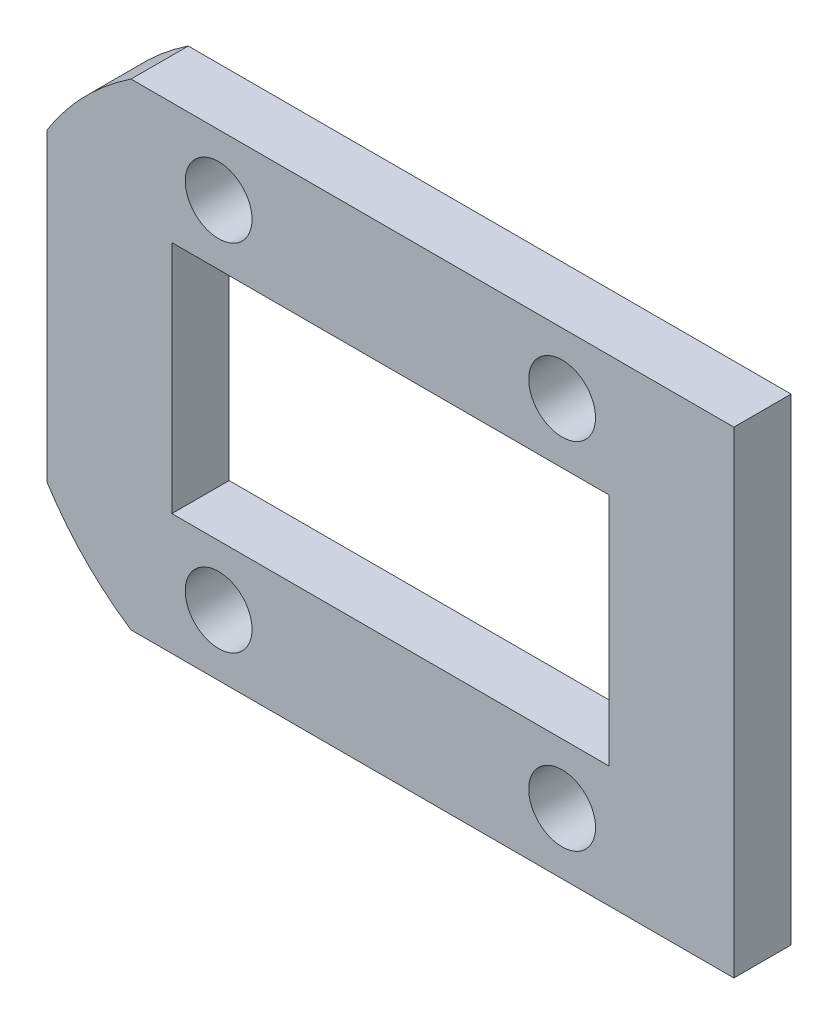
ISO-10303-21;
HEADER;
FILE_DESCRIPTION(('STEP AP214'),'2;1');
FILE_NAME('part.step','',(''),(''),'','','');
FILE_SCHEMA(('AUTOMOTIVE_DESIGN { 1 0 10303 214 1 1 1 1 }'));
ENDSEC;
DATA;
#1=APPLICATION_CONTEXT('core data for automotive mechanical design processes');
#2=APPLICATION_PROTOCOL_DEFINITION('international standard','automotive_design',2000,#1);
#3=PRODUCT_CONTEXT('',#1,'mechanical');
#4=PRODUCT('Part','Part','',(#3));
#5=PRODUCT_RELATED_PRODUCT_CATEGORY('part','',(#4));
#6=PRODUCT_DEFINITION_FORMATION('','',#4);
#7=PRODUCT_DEFINITION_CONTEXT('part definition',#1,'design');
#8=PRODUCT_DEFINITION('design','',#6,#7);
#9=PRODUCT_DEFINITION_SHAPE('','',#8);
#10=(LENGTH_UNIT() NAMED_UNIT(*) SI_UNIT(.MILLI.,.METRE.));
#11=(NAMED_UNIT(*) PLANE_ANGLE_UNIT() SI_UNIT($,.RADIAN.));
#12=(NAMED_UNIT(*) SI_UNIT($,.STERADIAN.) SOLID_ANGLE_UNIT());
#13=UNCERTAINTY_MEASURE_WITH_UNIT(LENGTH_MEASURE(1.E-05),#10,'distance_accuracy_value','');
#14=(GEOMETRIC_REPRESENTATION_CONTEXT(3) GLOBAL_UNCERTAINTY_ASSIGNED_CONTEXT((#13)) GLOBAL_UNIT_ASSIGNED_CONTEXT((#10,
#11,#12)) REPRESENTATION_CONTEXT('',''));
#15=CARTESIAN_POINT('',(0.,0.,0.));
#16=DIRECTION('',(0.,0.,1.));
#17=DIRECTION('',(1.,0.,0.));
#18=AXIS2_PLACEMENT_3D('',#15,#16,#17);
#19=CARTESIAN_POINT('',(-109.1,25.3,-11.45));
#20=DIRECTION('',(0.,0.,1.));
#21=DIRECTION('',(1.,0.,0.));
#22=AXIS2_PLACEMENT_3D('',#19,#20,#21);
#23=CYLINDRICAL_SURFACE('',#22,1.75);
#24=DIRECTION('',(0.,0.,1.));
#25=VECTOR('',#24,1.);
#26=CARTESIAN_POINT('',(-107.35,25.3,-11.45));
#27=LINE('',#26,#25);
#28=CARTESIAN_POINT('',(-107.35,25.3,-10.45));
#29=VERTEX_POINT('',#28);
#30=CARTESIAN_POINT('',(-107.35,25.3,-7.45));
#31=VERTEX_POINT('',#30);
#32=EDGE_CURVE('E11',#29,#31,#27,.T.);
#33=ORIENTED_EDGE('',*,*,#32,.F.);
#34=CARTESIAN_POINT('',(-109.1,25.3,-10.45));
#35=DIRECTION('',(0.,0.,1.));
#36=DIRECTION('',(1.,0.,0.));
#37=AXIS2_PLACEMENT_3D('',#34,#35,#36);
#38=CIRCLE('',#37,1.75);
#39=EDGE_CURVE('E238',#29,#29,#38,.T.);
#40=ORIENTED_EDGE('',*,*,#39,.F.);
#41=ORIENTED_EDGE('',*,*,#32,.T.);
#42=CARTESIAN_POINT('',(-109.1,25.3,-7.45));
#43=DIRECTION('',(0.,0.,1.));
#44=DIRECTION('',(1.,0.,0.));
#45=AXIS2_PLACEMENT_3D('',#42,#43,#44);
#46=CIRCLE('',#45,1.75);
#47=EDGE_CURVE('E164',#31,#31,#46,.T.);
#48=ORIENTED_EDGE('',*,*,#47,.T.);
#49=EDGE_LOOP('',(#33,#40,#41,#48));
#50=FACE_BOUND('',#49,.T.);
#51=ADVANCED_FACE('F17',(#50),#23,.F.);
#52=CARTESIAN_POINT('',(-129.55,22.15,-11.45));
#53=DIRECTION('',(0.,1.,0.));
#54=DIRECTION('',(1.,0.,0.));
#55=AXIS2_PLACEMENT_3D('',#52,#53,#54);
#56=PLANE('',#55);
#57=DIRECTION('',(-1.,0.,0.));
#58=VECTOR('',#57,1.);
#59=CARTESIAN_POINT('',(-132.825,22.15,-7.45));
#60=LINE('',#59,#58);
#61=CARTESIAN_POINT('',(-106.65,22.15,-7.45));
#62=VERTEX_POINT('',#61);
#63=CARTESIAN_POINT('',(-129.55,22.15,-7.45));
#64=VERTEX_POINT('',#63);
#65=EDGE_CURVE('E194',#62,#64,#60,.T.);
#66=ORIENTED_EDGE('',*,*,#65,.T.);
#67=DIRECTION('',(0.,0.,1.));
#68=VECTOR('',#67,1.);
#69=CARTESIAN_POINT('',(-129.55,22.15,-11.45));
#70=LINE('',#69,#68);
#71=CARTESIAN_POINT('',(-129.55,22.15,-10.45));
#72=VERTEX_POINT('',#71);
#73=EDGE_CURVE('E26',#72,#64,#70,.T.);
#74=ORIENTED_EDGE('',*,*,#73,.F.);
#75=DIRECTION('',(-1.,0.,0.));
#76=VECTOR('',#75,1.);
#77=CARTESIAN_POINT('',(-132.825,22.15,-10.45));
#78=LINE('',#77,#76);
#79=CARTESIAN_POINT('',(-106.65,22.15,-10.45));
#80=VERTEX_POINT('',#79);
#81=EDGE_CURVE('E230',#80,#72,#78,.T.);
#82=ORIENTED_EDGE('',*,*,#81,.F.);
#83=DIRECTION('',(0.,0.,1.));
#84=VECTOR('',#83,1.);
#85=CARTESIAN_POINT('',(-106.65,22.15,-11.45));
#86=LINE('',#85,#84);
#87=EDGE_CURVE('E263',#80,#62,#86,.T.);
#88=ORIENTED_EDGE('',*,*,#87,.T.);
#89=EDGE_LOOP('',(#66,#74,#82,#88));
#90=FACE_BOUND('',#89,.T.);
#91=ADVANCED_FACE('F19',(#90),#56,.F.);
#92=CARTESIAN_POINT('',(-129.55,9.85,-11.45));
#93=DIRECTION('',(1.,0.,0.));
#94=DIRECTION('',(0.,1.,0.));
#95=AXIS2_PLACEMENT_3D('',#92,#93,#94);
#96=PLANE('',#95);
#97=DIRECTION('',(0.,0.,1.));
#98=VECTOR('',#97,1.);
#99=CARTESIAN_POINT('',(-129.55,9.85,-11.45));
#100=LINE('',#99,#98);
#101=CARTESIAN_POINT('',(-129.55,9.85,-10.45));
#102=VERTEX_POINT('',#101);
#103=CARTESIAN_POINT('',(-129.55,9.85,-7.45));
#104=VERTEX_POINT('',#103);
#105=EDGE_CURVE('E46',#102,#104,#100,.T.);
#106=ORIENTED_EDGE('',*,*,#105,.F.);
#107=DIRECTION('',(0.,1.,0.));
#108=VECTOR('',#107,1.);
#109=CARTESIAN_POINT('',(-129.55,6.675,-10.45));
#110=LINE('',#109,#108);
#111=EDGE_CURVE('E239',#102,#72,#110,.T.);
#112=ORIENTED_EDGE('',*,*,#111,.T.);
#113=ORIENTED_EDGE('',*,*,#73,.T.);
#114=DIRECTION('',(0.,1.,0.));
#115=VECTOR('',#114,1.);
#116=CARTESIAN_POINT('',(-129.55,6.675,-7.45));
#117=LINE('',#116,#115);
#118=EDGE_CURVE('E200',#104,#64,#117,.T.);
#119=ORIENTED_EDGE('',*,*,#118,.F.);
#120=EDGE_LOOP('',(#106,#112,#113,#119));
#121=FACE_BOUND('',#120,.T.);
#122=ADVANCED_FACE('F308',(#121),#96,.T.);
#123=CARTESIAN_POINT('',(-106.65,9.85,-11.45));
#124=DIRECTION('',(1.,0.,0.));
#125=DIRECTION('',(0.,1.,0.));
#126=AXIS2_PLACEMENT_3D('',#123,#124,#125);
#127=PLANE('',#126);
#128=DIRECTION('',(0.,1.,0.));
#129=VECTOR('',#128,1.);
#130=CARTESIAN_POINT('',(-106.65,6.675,-7.45));
#131=LINE('',#130,#129);
#132=CARTESIAN_POINT('',(-106.65,9.85,-7.45));
#133=VERTEX_POINT('',#132);
#134=EDGE_CURVE('E190',#133,#62,#131,.T.);
#135=ORIENTED_EDGE('',*,*,#134,.T.);
#136=ORIENTED_EDGE('',*,*,#87,.F.);
#137=DIRECTION('',(0.,1.,0.));
#138=VECTOR('',#137,1.);
#139=CARTESIAN_POINT('',(-106.65,6.675,-10.45));
#140=LINE('',#139,#138);
#141=CARTESIAN_POINT('',(-106.65,9.85,-10.45));
#142=VERTEX_POINT('',#141);
#143=EDGE_CURVE('E226',#142,#80,#140,.T.);
#144=ORIENTED_EDGE('',*,*,#143,.F.);
#145=DIRECTION('',(0.,0.,1.));
#146=VECTOR('',#145,1.);
#147=CARTESIAN_POINT('',(-106.65,9.85,-11.45));
#148=LINE('',#147,#146);
#149=EDGE_CURVE('E247',#142,#133,#148,.T.);
#150=ORIENTED_EDGE('',*,*,#149,.T.);
#151=EDGE_LOOP('',(#135,#136,#144,#150));
#152=FACE_BOUND('',#151,.T.);
#153=ADVANCED_FACE('F325',(#152),#127,.F.);
#154=CARTESIAN_POINT('',(-129.55,9.85,-11.45));
#155=DIRECTION('',(0.,1.,0.));
#156=DIRECTION('',(1.,0.,0.));
#157=AXIS2_PLACEMENT_3D('',#154,#155,#156);
#158=PLANE('',#157);
#159=ORIENTED_EDGE('',*,*,#149,.F.);
#160=DIRECTION('',(-1.,0.,0.));
#161=VECTOR('',#160,1.);
#162=CARTESIAN_POINT('',(-132.825,9.85,-10.45));
#163=LINE('',#162,#161);
#164=EDGE_CURVE('E235',#142,#102,#163,.T.);
#165=ORIENTED_EDGE('',*,*,#164,.T.);
#166=ORIENTED_EDGE('',*,*,#105,.T.);
#167=DIRECTION('',(-1.,0.,0.));
#168=VECTOR('',#167,1.);
#169=CARTESIAN_POINT('',(-132.825,9.85,-7.45));
#170=LINE('',#169,#168);
#171=EDGE_CURVE('E217',#133,#104,#170,.T.);
#172=ORIENTED_EDGE('',*,*,#171,.F.);
#173=EDGE_LOOP('',(#159,#165,#166,#172));
#174=FACE_BOUND('',#173,.T.);
#175=ADVANCED_FACE('F319',(#174),#158,.T.);
#176=CARTESIAN_POINT('',(-127.1,25.3,-11.45));
#177=DIRECTION('',(0.,0.,1.));
#178=DIRECTION('',(1.,0.,0.));
#179=AXIS2_PLACEMENT_3D('',#176,#177,#178);
#180=CYLINDRICAL_SURFACE('',#179,1.75);
#181=DIRECTION('',(0.,0.,1.));
#182=VECTOR('',#181,1.);
#183=CARTESIAN_POINT('',(-125.35,25.3,-11.45));
#184=LINE('',#183,#182);
#185=CARTESIAN_POINT('',(-125.35,25.3,-10.45));
#186=VERTEX_POINT('',#185);
#187=CARTESIAN_POINT('',(-125.35,25.3,-7.45));
#188=VERTEX_POINT('',#187);
#189=EDGE_CURVE('E244',#186,#188,#184,.T.);
#190=ORIENTED_EDGE('',*,*,#189,.F.);
#191=CARTESIAN_POINT('',(-127.1,25.3,-10.45));
#192=DIRECTION('',(0.,0.,1.));
#193=DIRECTION('',(1.,0.,0.));
#194=AXIS2_PLACEMENT_3D('',#191,#192,#193);
#195=CIRCLE('',#194,1.75);
#196=EDGE_CURVE('E231',#186,#186,#195,.T.);
#197=ORIENTED_EDGE('',*,*,#196,.F.);
#198=ORIENTED_EDGE('',*,*,#189,.T.);
#199=CARTESIAN_POINT('',(-127.1,25.3,-7.45));
#200=DIRECTION('',(0.,0.,1.));
#201=DIRECTION('',(1.,0.,0.));
#202=AXIS2_PLACEMENT_3D('',#199,#200,#201);
#203=CIRCLE('',#202,1.75);
#204=EDGE_CURVE('E221',#188,#188,#203,.T.);
#205=ORIENTED_EDGE('',*,*,#204,.T.);
#206=EDGE_LOOP('',(#190,#197,#198,#205));
#207=FACE_BOUND('',#206,.T.);
#208=ADVANCED_FACE('F333',(#207),#180,.F.);
#209=CARTESIAN_POINT('',(-109.1,6.7,-11.45));
#210=DIRECTION('',(0.,0.,1.));
#211=DIRECTION('',(1.,0.,0.));
#212=AXIS2_PLACEMENT_3D('',#209,#210,#211);
#213=CYLINDRICAL_SURFACE('',#212,1.75);
#214=DIRECTION('',(0.,0.,1.));
#215=VECTOR('',#214,1.);
#216=CARTESIAN_POINT('',(-107.35,6.7,-11.45));
#217=LINE('',#216,#215);
#218=CARTESIAN_POINT('',(-107.35,6.7,-10.45));
#219=VERTEX_POINT('',#218);
#220=CARTESIAN_POINT('',(-107.35,6.7,-7.45));
#221=VERTEX_POINT('',#220);
#222=EDGE_CURVE('E215',#219,#221,#217,.T.);
#223=ORIENTED_EDGE('',*,*,#222,.F.);
#224=CARTESIAN_POINT('',(-109.1,6.7,-10.45));
#225=DIRECTION('',(0.,0.,1.));
#226=DIRECTION('',(1.,0.,0.));
#227=AXIS2_PLACEMENT_3D('',#224,#225,#226);
#228=CIRCLE('',#227,1.75);
#229=EDGE_CURVE('E281',#219,#219,#228,.T.);
#230=ORIENTED_EDGE('',*,*,#229,.F.);
#231=ORIENTED_EDGE('',*,*,#222,.T.);
#232=CARTESIAN_POINT('',(-109.1,6.7,-7.45));
#233=DIRECTION('',(0.,0.,1.));
#234=DIRECTION('',(1.,0.,0.));
#235=AXIS2_PLACEMENT_3D('',#232,#233,#234);
#236=CIRCLE('',#235,1.75);
#237=EDGE_CURVE('E243',#221,#221,#236,.T.);
#238=ORIENTED_EDGE('',*,*,#237,.T.);
#239=EDGE_LOOP('',(#223,#230,#231,#238));
#240=FACE_BOUND('',#239,.T.);
#241=ADVANCED_FACE('F345',(#240),#213,.F.);
#242=CARTESIAN_POINT('',(-127.1,6.7,-11.45));
#243=DIRECTION('',(0.,0.,1.));
#244=DIRECTION('',(1.,0.,0.));
#245=AXIS2_PLACEMENT_3D('',#242,#243,#244);
#246=CYLINDRICAL_SURFACE('',#245,1.75);
#247=DIRECTION('',(0.,0.,1.));
#248=VECTOR('',#247,1.);
#249=CARTESIAN_POINT('',(-125.35,6.7,-11.45));
#250=LINE('',#249,#248);
#251=CARTESIAN_POINT('',(-125.35,6.7,-10.45));
#252=VERTEX_POINT('',#251);
#253=CARTESIAN_POINT('',(-125.35,6.7,-7.45));
#254=VERTEX_POINT('',#253);
#255=EDGE_CURVE('E212',#252,#254,#250,.T.);
#256=ORIENTED_EDGE('',*,*,#255,.F.);
#257=CARTESIAN_POINT('',(-127.1,6.7,-10.45));
#258=DIRECTION('',(0.,0.,1.));
#259=DIRECTION('',(1.,0.,0.));
#260=AXIS2_PLACEMENT_3D('',#257,#258,#259);
#261=CIRCLE('',#260,1.75);
#262=EDGE_CURVE('E277',#252,#252,#261,.T.);
#263=ORIENTED_EDGE('',*,*,#262,.F.);
#264=ORIENTED_EDGE('',*,*,#255,.T.);
#265=CARTESIAN_POINT('',(-127.1,6.7,-7.45));
#266=DIRECTION('',(0.,0.,1.));
#267=DIRECTION('',(1.,0.,0.));
#268=AXIS2_PLACEMENT_3D('',#265,#266,#267);
#269=CIRCLE('',#268,1.75);
#270=EDGE_CURVE('E234',#254,#254,#269,.T.);
#271=ORIENTED_EDGE('',*,*,#270,.T.);
#272=EDGE_LOOP('',(#256,#263,#264,#271));
#273=FACE_BOUND('',#272,.T.);
#274=ADVANCED_FACE('F344',(#273),#246,.F.);
#275=CARTESIAN_POINT('',(-136.1,3.5,-10.45));
#276=DIRECTION('',(0.,1.,0.));
#277=DIRECTION('',(1.,0.,0.));
#278=AXIS2_PLACEMENT_3D('',#275,#276,#277);
#279=PLANE('',#278);
#280=DIRECTION('',(0.,0.,1.));
#281=VECTOR('',#280,1.);
#282=CARTESIAN_POINT('',(-100.1,3.5,-10.45));
#283=LINE('',#282,#281);
#284=CARTESIAN_POINT('',(-100.1,3.5,-10.45));
#285=VERTEX_POINT('',#284);
#286=CARTESIAN_POINT('',(-100.1,3.5,-7.45));
#287=VERTEX_POINT('',#286);
#288=EDGE_CURVE('E216',#285,#287,#283,.T.);
#289=ORIENTED_EDGE('',*,*,#288,.T.);
#290=DIRECTION('',(1.,0.,0.));
#291=VECTOR('',#290,1.);
#292=CARTESIAN_POINT('',(-136.1,3.5,-7.45));
#293=LINE('',#292,#291);
#294=CARTESIAN_POINT('',(-131.6915619758,3.5,-7.45));
#295=VERTEX_POINT('',#294);
#296=EDGE_CURVE('E187',#295,#287,#293,.T.);
#297=ORIENTED_EDGE('',*,*,#296,.F.);
#298=DIRECTION('',(0.,0.,1.));
#299=VECTOR('',#298,1.);
#300=CARTESIAN_POINT('',(-131.6915619758,3.5,-11.45));
#301=LINE('',#300,#299);
#302=CARTESIAN_POINT('',(-131.6915619758,3.5,-10.45));
#303=VERTEX_POINT('',#302);
#304=EDGE_CURVE('E293',#303,#295,#301,.T.);
#305=ORIENTED_EDGE('',*,*,#304,.F.);
#306=DIRECTION('',(1.,0.,0.));
#307=VECTOR('',#306,1.);
#308=CARTESIAN_POINT('',(-136.1,3.5,-10.45));
#309=LINE('',#308,#307);
#310=EDGE_CURVE('E271',#303,#285,#309,.T.);
#311=ORIENTED_EDGE('',*,*,#310,.T.);
#312=EDGE_LOOP('',(#289,#297,#305,#311));
#313=FACE_BOUND('',#312,.T.);
#314=ADVANCED_FACE('F375',(#313),#279,.F.);
#315=CARTESIAN_POINT('',(-100.1,3.5,-10.45));
#316=DIRECTION('',(1.,0.,0.));
#317=DIRECTION('',(0.,1.,0.));
#318=AXIS2_PLACEMENT_3D('',#315,#316,#317);
#319=PLANE('',#318);
#320=ORIENTED_EDGE('',*,*,#288,.F.);
#321=DIRECTION('',(0.,1.,0.));
#322=VECTOR('',#321,1.);
#323=CARTESIAN_POINT('',(-100.1,3.5,-10.45));
#324=LINE('',#323,#322);
#325=CARTESIAN_POINT('',(-100.1,28.5,-10.45));
#326=VERTEX_POINT('',#325);
#327=EDGE_CURVE('E254',#285,#326,#324,.T.);
#328=ORIENTED_EDGE('',*,*,#327,.T.);
#329=DIRECTION('',(0.,0.,1.));
#330=VECTOR('',#329,1.);
#331=CARTESIAN_POINT('',(-100.1,28.5,-10.45));
#332=LINE('',#331,#330);
#333=CARTESIAN_POINT('',(-100.1,28.5,-7.45));
#334=VERTEX_POINT('',#333);
#335=EDGE_CURVE('E296',#326,#334,#332,.T.);
#336=ORIENTED_EDGE('',*,*,#335,.T.);
#337=DIRECTION('',(0.,1.,0.));
#338=VECTOR('',#337,1.);
#339=CARTESIAN_POINT('',(-100.1,3.5,-7.45));
#340=LINE('',#339,#338);
#341=EDGE_CURVE('E207',#287,#334,#340,.T.);
#342=ORIENTED_EDGE('',*,*,#341,.F.);
#343=EDGE_LOOP('',(#320,#328,#336,#342));
#344=FACE_BOUND('',#343,.T.);
#345=ADVANCED_FACE('F384',(#344),#319,.T.);
#346=CARTESIAN_POINT('',(-136.1,28.5,-10.45));
#347=DIRECTION('',(0.,1.,0.));
#348=DIRECTION('',(1.,0.,0.));
#349=AXIS2_PLACEMENT_3D('',#346,#347,#348);
#350=PLANE('',#349);
#351=DIRECTION('',(1.,0.,0.));
#352=VECTOR('',#351,1.);
#353=CARTESIAN_POINT('',(-136.1,28.5,-10.45));
#354=LINE('',#353,#352);
#355=CARTESIAN_POINT('',(-131.6915619758,28.5,-10.45));
#356=VERTEX_POINT('',#355);
#357=EDGE_CURVE('E251',#356,#326,#354,.T.);
#358=ORIENTED_EDGE('',*,*,#357,.F.);
#359=DIRECTION('',(0.,0.,1.));
#360=VECTOR('',#359,1.);
#361=CARTESIAN_POINT('',(-131.6915619758,28.5,-11.45));
#362=LINE('',#361,#360);
#363=CARTESIAN_POINT('',(-131.6915619758,28.5,-7.45));
#364=VERTEX_POINT('',#363);
#365=EDGE_CURVE('E160',#356,#364,#362,.T.);
#366=ORIENTED_EDGE('',*,*,#365,.T.);
#367=DIRECTION('',(1.,0.,0.));
#368=VECTOR('',#367,1.);
#369=CARTESIAN_POINT('',(-136.1,28.5,-7.45));
#370=LINE('',#369,#368);
#371=EDGE_CURVE('E211',#364,#334,#370,.T.);
#372=ORIENTED_EDGE('',*,*,#371,.T.);
#373=ORIENTED_EDGE('',*,*,#335,.F.);
#374=EDGE_LOOP('',(#358,#366,#372,#373));
#375=FACE_BOUND('',#374,.T.);
#376=ADVANCED_FACE('F387',(#375),#350,.T.);
#377=CARTESIAN_POINT('',(-123.4,16.,-11.45));
#378=DIRECTION('',(0.,0.,1.));
#379=DIRECTION('',(1.,0.,0.));
#380=AXIS2_PLACEMENT_3D('',#377,#378,#379);
#381=CYLINDRICAL_SURFACE('',#380,15.);
#382=DIRECTION('',(0.,0.,1.));
#383=VECTOR('',#382,1.);
#384=CARTESIAN_POINT('',(-136.1,8.018145578877,-11.45));
#385=LINE('',#384,#383);
#386=CARTESIAN_POINT('',(-136.1,8.018145578877,-10.45));
#387=VERTEX_POINT('',#386);
#388=CARTESIAN_POINT('',(-136.1,8.018145578877,-7.45));
#389=VERTEX_POINT('',#388);
#390=EDGE_CURVE('E176',#387,#389,#385,.T.);
#391=ORIENTED_EDGE('',*,*,#390,.F.);
#392=CARTESIAN_POINT('',(-123.4,16.,-10.45));
#393=DIRECTION('',(0.,0.,1.));
#394=DIRECTION('',(1.,0.,0.));
#395=AXIS2_PLACEMENT_3D('',#392,#393,#394);
#396=CIRCLE('',#395,15.);
#397=EDGE_CURVE('E171',#387,#303,#396,.T.);
#398=ORIENTED_EDGE('',*,*,#397,.T.);
#399=ORIENTED_EDGE('',*,*,#304,.T.);
#400=CARTESIAN_POINT('',(-123.4,16.,-7.45));
#401=DIRECTION('',(0.,0.,1.));
#402=DIRECTION('',(1.,0.,0.));
#403=AXIS2_PLACEMENT_3D('',#400,#401,#402);
#404=CIRCLE('',#403,15.);
#405=EDGE_CURVE('E201',#389,#295,#404,.T.);
#406=ORIENTED_EDGE('',*,*,#405,.F.);
#407=EDGE_LOOP('',(#391,#398,#399,#406));
#408=FACE_BOUND('',#407,.T.);
#409=ADVANCED_FACE('F357',(#408),#381,.T.);
#410=CARTESIAN_POINT('',(-136.1,3.5,-10.45));
#411=DIRECTION('',(0.,0.,1.));
#412=DIRECTION('',(1.,0.,0.));
#413=AXIS2_PLACEMENT_3D('',#410,#411,#412);
#414=PLANE('',#413);
#415=ORIENTED_EDGE('',*,*,#39,.T.);
#416=EDGE_LOOP('',(#415));
#417=FACE_BOUND('',#416,.T.);
#418=ORIENTED_EDGE('',*,*,#143,.T.);
#419=ORIENTED_EDGE('',*,*,#81,.T.);
#420=ORIENTED_EDGE('',*,*,#111,.F.);
#421=ORIENTED_EDGE('',*,*,#164,.F.);
#422=EDGE_LOOP('',(#418,#419,#420,#421));
#423=FACE_BOUND('',#422,.T.);
#424=ORIENTED_EDGE('',*,*,#196,.T.);
#425=EDGE_LOOP('',(#424));
#426=FACE_BOUND('',#425,.T.);
#427=ORIENTED_EDGE('',*,*,#229,.T.);
#428=EDGE_LOOP('',(#427));
#429=FACE_BOUND('',#428,.T.);
#430=ORIENTED_EDGE('',*,*,#262,.T.);
#431=EDGE_LOOP('',(#430));
#432=FACE_BOUND('',#431,.T.);
#433=CARTESIAN_POINT('',(-123.4,16.,-10.45));
#434=DIRECTION('',(0.,0.,1.));
#435=DIRECTION('',(1.,0.,0.));
#436=AXIS2_PLACEMENT_3D('',#433,#434,#435);
#437=CIRCLE('',#436,15.);
#438=CARTESIAN_POINT('',(-136.1,23.981854421123,-10.45));
#439=VERTEX_POINT('',#438);
#440=EDGE_CURVE('E154',#356,#439,#437,.T.);
#441=ORIENTED_EDGE('',*,*,#440,.F.);
#442=ORIENTED_EDGE('',*,*,#357,.T.);
#443=ORIENTED_EDGE('',*,*,#327,.F.);
#444=ORIENTED_EDGE('',*,*,#310,.F.);
#445=ORIENTED_EDGE('',*,*,#397,.F.);
#446=DIRECTION('',(0.,1.,0.));
#447=VECTOR('',#446,1.);
#448=CARTESIAN_POINT('',(-136.1,3.5,-10.45));
#449=LINE('',#448,#447);
#450=EDGE_CURVE('E167',#387,#439,#449,.T.);
#451=ORIENTED_EDGE('',*,*,#450,.T.);
#452=EDGE_LOOP('',(#441,#442,#443,#444,#445,#451));
#453=FACE_BOUND('',#452,.T.);
#454=ADVANCED_FACE('F168',(#417,#423,#426,#429,#432,#453),#414,.F.);
#455=CARTESIAN_POINT('',(-123.4,16.,-11.45));
#456=DIRECTION('',(0.,0.,1.));
#457=DIRECTION('',(1.,0.,0.));
#458=AXIS2_PLACEMENT_3D('',#455,#456,#457);
#459=CYLINDRICAL_SURFACE('',#458,15.);
#460=ORIENTED_EDGE('',*,*,#440,.T.);
#461=DIRECTION('',(0.,0.,1.));
#462=VECTOR('',#461,1.);
#463=CARTESIAN_POINT('',(-136.1,23.981854421123,-11.45));
#464=LINE('',#463,#462);
#465=CARTESIAN_POINT('',(-136.1,23.981854421123,-7.45));
#466=VERTEX_POINT('',#465);
#467=EDGE_CURVE('E159',#439,#466,#464,.T.);
#468=ORIENTED_EDGE('',*,*,#467,.T.);
#469=CARTESIAN_POINT('',(-123.4,16.,-7.45));
#470=DIRECTION('',(0.,0.,1.));
#471=DIRECTION('',(1.,0.,0.));
#472=AXIS2_PLACEMENT_3D('',#469,#470,#471);
#473=CIRCLE('',#472,15.);
#474=EDGE_CURVE('E225',#364,#466,#473,.T.);
#475=ORIENTED_EDGE('',*,*,#474,.F.);
#476=ORIENTED_EDGE('',*,*,#365,.F.);
#477=EDGE_LOOP('',(#460,#468,#475,#476));
#478=FACE_BOUND('',#477,.T.);
#479=ADVANCED_FACE('F156',(#478),#459,.T.);
#480=CARTESIAN_POINT('',(-136.1,3.5,-7.45));
#481=DIRECTION('',(0.,0.,1.));
#482=DIRECTION('',(1.,0.,0.));
#483=AXIS2_PLACEMENT_3D('',#480,#481,#482);
#484=PLANE('',#483);
#485=ORIENTED_EDGE('',*,*,#47,.F.);
#486=EDGE_LOOP('',(#485));
#487=FACE_BOUND('',#486,.T.);
#488=ORIENTED_EDGE('',*,*,#171,.T.);
#489=ORIENTED_EDGE('',*,*,#118,.T.);
#490=ORIENTED_EDGE('',*,*,#65,.F.);
#491=ORIENTED_EDGE('',*,*,#134,.F.);
#492=EDGE_LOOP('',(#488,#489,#490,#491));
#493=FACE_BOUND('',#492,.T.);
#494=ORIENTED_EDGE('',*,*,#204,.F.);
#495=EDGE_LOOP('',(#494));
#496=FACE_BOUND('',#495,.T.);
#497=ORIENTED_EDGE('',*,*,#237,.F.);
#498=EDGE_LOOP('',(#497));
#499=FACE_BOUND('',#498,.T.);
#500=ORIENTED_EDGE('',*,*,#270,.F.);
#501=EDGE_LOOP('',(#500));
#502=FACE_BOUND('',#501,.T.);
#503=DIRECTION('',(0.,1.,0.));
#504=VECTOR('',#503,1.);
#505=CARTESIAN_POINT('',(-136.1,3.5,-7.45));
#506=LINE('',#505,#504);
#507=EDGE_CURVE('E181',#389,#466,#506,.T.);
#508=ORIENTED_EDGE('',*,*,#507,.F.);
#509=ORIENTED_EDGE('',*,*,#405,.T.);
#510=ORIENTED_EDGE('',*,*,#296,.T.);
#511=ORIENTED_EDGE('',*,*,#341,.T.);
#512=ORIENTED_EDGE('',*,*,#371,.F.);
#513=ORIENTED_EDGE('',*,*,#474,.T.);
#514=EDGE_LOOP('',(#508,#509,#510,#511,#512,#513));
#515=FACE_BOUND('',#514,.T.);
#516=ADVANCED_FACE('F315',(#487,#493,#496,#499,#502,#515),#484,.T.);
#517=CARTESIAN_POINT('',(-136.1,3.5,-10.45));
#518=DIRECTION('',(1.,0.,0.));
#519=DIRECTION('',(0.,1.,0.));
#520=AXIS2_PLACEMENT_3D('',#517,#518,#519);
#521=PLANE('',#520);
#522=ORIENTED_EDGE('',*,*,#467,.F.);
#523=ORIENTED_EDGE('',*,*,#450,.F.);
#524=ORIENTED_EDGE('',*,*,#390,.T.);
#525=ORIENTED_EDGE('',*,*,#507,.T.);
#526=EDGE_LOOP('',(#522,#523,#524,#525));
#527=FACE_BOUND('',#526,.T.);
#528=ADVANCED_FACE('F179',(#527),#521,.F.);
#529=CLOSED_SHELL('',(#51,#91,#122,#153,#175,#208,#241,#274,#314,#345,#376,#409,#454,#479,#516,#528));
#530=MANIFOLD_SOLID_BREP('B1',#529);
#531=ADVANCED_BREP_SHAPE_REPRESENTATION('',(#18,#530),#14);
#532=SHAPE_DEFINITION_REPRESENTATION(#9,#531);
ENDSEC;
END-ISO-10303-21;
